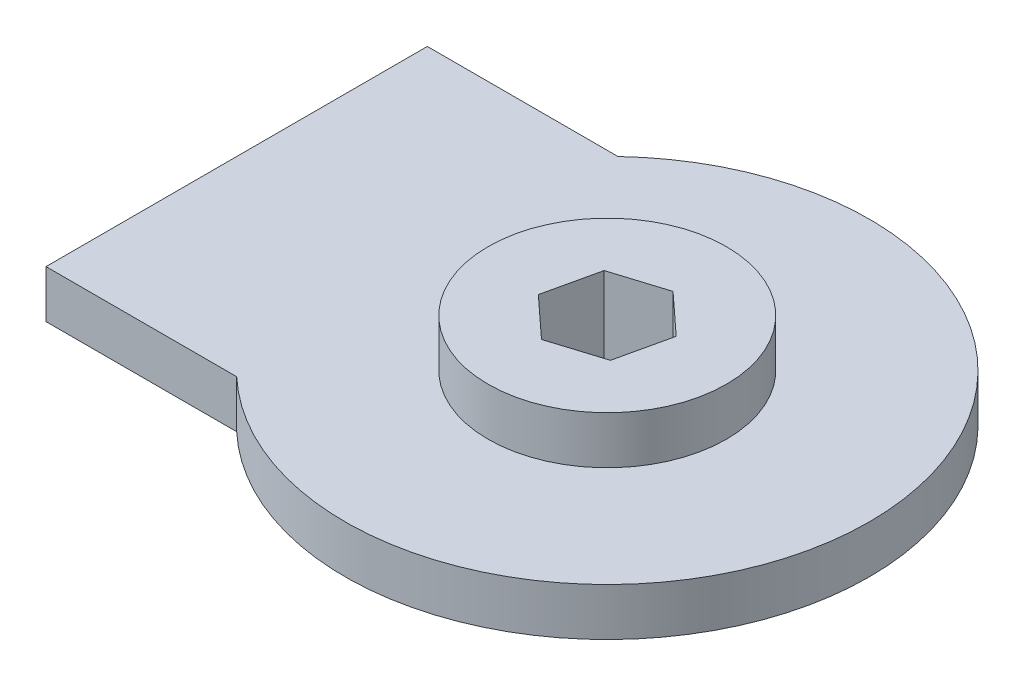
ISO-10303-21;
HEADER;
FILE_DESCRIPTION(('STEP AP214'),'2;1');
FILE_NAME('part.step','',(''),(''),'','','');
FILE_SCHEMA(('AUTOMOTIVE_DESIGN { 1 0 10303 214 1 1 1 1 }'));
ENDSEC;
DATA;
#1=APPLICATION_CONTEXT('core data for automotive mechanical design processes');
#2=APPLICATION_PROTOCOL_DEFINITION('international standard','automotive_design',2000,#1);
#3=PRODUCT_CONTEXT('',#1,'mechanical');
#4=PRODUCT('Part','Part','',(#3));
#5=PRODUCT_RELATED_PRODUCT_CATEGORY('part','',(#4));
#6=PRODUCT_DEFINITION_FORMATION('','',#4);
#7=PRODUCT_DEFINITION_CONTEXT('part definition',#1,'design');
#8=PRODUCT_DEFINITION('design','',#6,#7);
#9=PRODUCT_DEFINITION_SHAPE('','',#8);
#10=(LENGTH_UNIT() NAMED_UNIT(*) SI_UNIT(.MILLI.,.METRE.));
#11=(NAMED_UNIT(*) PLANE_ANGLE_UNIT() SI_UNIT($,.RADIAN.));
#12=(NAMED_UNIT(*) SI_UNIT($,.STERADIAN.) SOLID_ANGLE_UNIT());
#13=UNCERTAINTY_MEASURE_WITH_UNIT(LENGTH_MEASURE(1.E-05),#10,'distance_accuracy_value','');
#14=(GEOMETRIC_REPRESENTATION_CONTEXT(3) GLOBAL_UNCERTAINTY_ASSIGNED_CONTEXT((#13)) GLOBAL_UNIT_ASSIGNED_CONTEXT((#10,
#11,#12)) REPRESENTATION_CONTEXT('',''));
#15=CARTESIAN_POINT('',(0.,0.,0.));
#16=DIRECTION('',(0.,0.,1.));
#17=DIRECTION('',(1.,0.,0.));
#18=AXIS2_PLACEMENT_3D('',#15,#16,#17);
#19=CARTESIAN_POINT('',(0.,6.35,25.4));
#20=DIRECTION('',(0.,0.,1.));
#21=DIRECTION('',(1.,0.,0.));
#22=AXIS2_PLACEMENT_3D('',#19,#20,#21);
#23=PLANE('',#22);
#24=DIRECTION('',(-1.,0.,0.));
#25=VECTOR('',#24,1.);
#26=CARTESIAN_POINT('',(0.,0.,25.4));
#27=LINE('',#26,#25);
#28=CARTESIAN_POINT('',(-23.9707243319846,0.,25.4));
#29=VERTEX_POINT('',#28);
#30=CARTESIAN_POINT('',(-49.3707243319846,0.,25.4));
#31=VERTEX_POINT('',#30);
#32=EDGE_CURVE('E166',#29,#31,#27,.T.);
#33=ORIENTED_EDGE('',*,*,#32,.F.);
#34=DIRECTION('',(0.,-1.,0.));
#35=VECTOR('',#34,1.);
#36=CARTESIAN_POINT('',(-23.9707243319846,6.35,25.4));
#37=LINE('',#36,#35);
#38=CARTESIAN_POINT('',(-23.9707243319846,6.35,25.4));
#39=VERTEX_POINT('',#38);
#40=EDGE_CURVE('E11',#39,#29,#37,.T.);
#41=ORIENTED_EDGE('',*,*,#40,.F.);
#42=DIRECTION('',(-1.,0.,0.));
#43=VECTOR('',#42,1.);
#44=CARTESIAN_POINT('',(0.,6.35,25.4));
#45=LINE('',#44,#43);
#46=CARTESIAN_POINT('',(-49.3707243319846,6.35,25.4));
#47=VERTEX_POINT('',#46);
#48=EDGE_CURVE('E169',#39,#47,#45,.T.);
#49=ORIENTED_EDGE('',*,*,#48,.T.);
#50=DIRECTION('',(0.,-1.,0.));
#51=VECTOR('',#50,1.);
#52=CARTESIAN_POINT('',(-49.3707243319846,6.35,25.4));
#53=LINE('',#52,#51);
#54=EDGE_CURVE('E179',#47,#31,#53,.T.);
#55=ORIENTED_EDGE('',*,*,#54,.T.);
#56=EDGE_LOOP('',(#33,#41,#49,#55));
#57=FACE_BOUND('',#56,.T.);
#58=ADVANCED_FACE('F35',(#57),#23,.T.);
#59=CARTESIAN_POINT('',(0.,6.35,0.));
#60=DIRECTION('',(0.,-1.,0.));
#61=DIRECTION('',(0.,0.,-1.));
#62=AXIS2_PLACEMENT_3D('',#59,#60,#61);
#63=CYLINDRICAL_SURFACE('',#62,34.925);
#64=CARTESIAN_POINT('',(0.,0.,0.));
#65=DIRECTION('',(0.,1.,0.));
#66=DIRECTION('',(0.,0.,1.));
#67=AXIS2_PLACEMENT_3D('',#64,#65,#66);
#68=CIRCLE('',#67,34.925);
#69=CARTESIAN_POINT('',(-23.9707243319846,0.,-25.4));
#70=VERTEX_POINT('',#69);
#71=EDGE_CURVE('E182',#29,#70,#68,.T.);
#72=ORIENTED_EDGE('',*,*,#71,.T.);
#73=DIRECTION('',(0.,-1.,0.));
#74=VECTOR('',#73,1.);
#75=CARTESIAN_POINT('',(-23.9707243319846,6.35,-25.4));
#76=LINE('',#75,#74);
#77=CARTESIAN_POINT('',(-23.9707243319846,6.35,-25.4));
#78=VERTEX_POINT('',#77);
#79=EDGE_CURVE('E42',#78,#70,#76,.T.);
#80=ORIENTED_EDGE('',*,*,#79,.F.);
#81=CARTESIAN_POINT('',(0.,6.35,0.));
#82=DIRECTION('',(0.,1.,0.));
#83=DIRECTION('',(0.,0.,1.));
#84=AXIS2_PLACEMENT_3D('',#81,#82,#83);
#85=CIRCLE('',#84,34.925);
#86=EDGE_CURVE('E172',#39,#78,#85,.T.);
#87=ORIENTED_EDGE('',*,*,#86,.F.);
#88=ORIENTED_EDGE('',*,*,#40,.T.);
#89=EDGE_LOOP('',(#72,#80,#87,#88));
#90=FACE_BOUND('',#89,.T.);
#91=ADVANCED_FACE('F210',(#90),#63,.T.);
#92=CARTESIAN_POINT('',(0.,6.35,-25.4));
#93=DIRECTION('',(0.,0.,1.));
#94=DIRECTION('',(1.,0.,0.));
#95=AXIS2_PLACEMENT_3D('',#92,#93,#94);
#96=PLANE('',#95);
#97=DIRECTION('',(-1.,0.,0.));
#98=VECTOR('',#97,1.);
#99=CARTESIAN_POINT('',(0.,0.,-25.4));
#100=LINE('',#99,#98);
#101=CARTESIAN_POINT('',(-49.3707243319846,0.,-25.4));
#102=VERTEX_POINT('',#101);
#103=EDGE_CURVE('E184',#70,#102,#100,.T.);
#104=ORIENTED_EDGE('',*,*,#103,.T.);
#105=DIRECTION('',(0.,-1.,0.));
#106=VECTOR('',#105,1.);
#107=CARTESIAN_POINT('',(-49.3707243319846,6.35,-25.4));
#108=LINE('',#107,#106);
#109=CARTESIAN_POINT('',(-49.3707243319846,6.35,-25.4));
#110=VERTEX_POINT('',#109);
#111=EDGE_CURVE('E189',#110,#102,#108,.T.);
#112=ORIENTED_EDGE('',*,*,#111,.F.);
#113=DIRECTION('',(-1.,0.,0.));
#114=VECTOR('',#113,1.);
#115=CARTESIAN_POINT('',(0.,6.35,-25.4));
#116=LINE('',#115,#114);
#117=EDGE_CURVE('E175',#78,#110,#116,.T.);
#118=ORIENTED_EDGE('',*,*,#117,.F.);
#119=ORIENTED_EDGE('',*,*,#79,.T.);
#120=EDGE_LOOP('',(#104,#112,#118,#119));
#121=FACE_BOUND('',#120,.T.);
#122=ADVANCED_FACE('F196',(#121),#96,.F.);
#123=CARTESIAN_POINT('',(-49.3707243319846,6.35,0.));
#124=DIRECTION('',(1.,0.,0.));
#125=DIRECTION('',(0.,0.,-1.));
#126=AXIS2_PLACEMENT_3D('',#123,#124,#125);
#127=PLANE('',#126);
#128=DIRECTION('',(0.,0.,1.));
#129=VECTOR('',#128,1.);
#130=CARTESIAN_POINT('',(-49.3707243319846,0.,0.));
#131=LINE('',#130,#129);
#132=EDGE_CURVE('E173',#102,#31,#131,.T.);
#133=ORIENTED_EDGE('',*,*,#132,.T.);
#134=ORIENTED_EDGE('',*,*,#54,.F.);
#135=DIRECTION('',(0.,0.,1.));
#136=VECTOR('',#135,1.);
#137=CARTESIAN_POINT('',(-49.3707243319846,6.35,0.));
#138=LINE('',#137,#136);
#139=EDGE_CURVE('E177',#110,#47,#138,.T.);
#140=ORIENTED_EDGE('',*,*,#139,.F.);
#141=ORIENTED_EDGE('',*,*,#111,.T.);
#142=EDGE_LOOP('',(#133,#134,#140,#141));
#143=FACE_BOUND('',#142,.T.);
#144=ADVANCED_FACE('F205',(#143),#127,.F.);
#145=CARTESIAN_POINT('',(0.,6.35,0.));
#146=DIRECTION('',(0.,1.,0.));
#147=DIRECTION('',(0.,0.,1.));
#148=AXIS2_PLACEMENT_3D('',#145,#146,#147);
#149=PLANE('',#148);
#150=CARTESIAN_POINT('',(0.,6.35,0.));
#151=DIRECTION('',(0.,1.,0.));
#152=DIRECTION('',(0.,0.,1.));
#153=AXIS2_PLACEMENT_3D('',#150,#151,#152);
#154=CIRCLE('',#153,15.875);
#155=CARTESIAN_POINT('',(0.,6.35,15.875));
#156=VERTEX_POINT('',#155);
#157=EDGE_CURVE('E155',#156,#156,#154,.T.);
#158=ORIENTED_EDGE('',*,*,#157,.F.);
#159=EDGE_LOOP('',(#158));
#160=FACE_BOUND('',#159,.T.);
#161=ORIENTED_EDGE('',*,*,#48,.F.);
#162=ORIENTED_EDGE('',*,*,#86,.T.);
#163=ORIENTED_EDGE('',*,*,#117,.T.);
#164=ORIENTED_EDGE('',*,*,#139,.T.);
#165=EDGE_LOOP('',(#161,#162,#163,#164));
#166=FACE_BOUND('',#165,.T.);
#167=ADVANCED_FACE('F209',(#160,#166),#149,.T.);
#168=CARTESIAN_POINT('',(0.,0.,0.));
#169=DIRECTION('',(0.,1.,0.));
#170=DIRECTION('',(0.,0.,1.));
#171=AXIS2_PLACEMENT_3D('',#168,#169,#170);
#172=PLANE('',#171);
#173=DIRECTION('',(0.73526417581075,0.,0.677780636909419));
#174=VECTOR('',#173,1.);
#175=CARTESIAN_POINT('',(-6.9995136027942,0.,2.18406562576134));
#176=LINE('',#175,#174);
#177=CARTESIAN_POINT('',(-6.9995136027942,0.,2.18406562576134));
#178=VERTEX_POINT('',#177);
#179=CARTESIAN_POINT('',(-1.60830048595542,0.,7.15378940703519));
#180=VERTEX_POINT('',#179);
#181=EDGE_CURVE('E118',#178,#180,#176,.T.);
#182=ORIENTED_EDGE('',*,*,#181,.T.);
#183=DIRECTION('',(0.954607337662129,0.,-0.297867136290028));
#184=VECTOR('',#183,1.);
#185=CARTESIAN_POINT('',(-1.60830048595542,0.,7.15378940703519));
#186=LINE('',#185,#184);
#187=CARTESIAN_POINT('',(5.39121311683878,0.,4.96972378127385));
#188=VERTEX_POINT('',#187);
#189=EDGE_CURVE('E112',#180,#188,#186,.T.);
#190=ORIENTED_EDGE('',*,*,#189,.T.);
#191=DIRECTION('',(0.219343161851379,0.,-0.975647773199447));
#192=VECTOR('',#191,1.);
#193=CARTESIAN_POINT('',(5.39121311683878,0.,4.96972378127385));
#194=LINE('',#193,#192);
#195=CARTESIAN_POINT('',(6.9995136027942,0.,-2.18406562576134));
#196=VERTEX_POINT('',#195);
#197=EDGE_CURVE('E121',#188,#196,#194,.T.);
#198=ORIENTED_EDGE('',*,*,#197,.T.);
#199=DIRECTION('',(-0.73526417581075,0.,-0.677780636909419));
#200=VECTOR('',#199,1.);
#201=CARTESIAN_POINT('',(6.9995136027942,0.,-2.18406562576134));
#202=LINE('',#201,#200);
#203=CARTESIAN_POINT('',(1.60830048595543,0.,-7.15378940703519));
#204=VERTEX_POINT('',#203);
#205=EDGE_CURVE('E49',#196,#204,#202,.T.);
#206=ORIENTED_EDGE('',*,*,#205,.T.);
#207=DIRECTION('',(-0.954607337662129,0.,0.297867136290028));
#208=VECTOR('',#207,1.);
#209=CARTESIAN_POINT('',(1.60830048595543,0.,-7.15378940703519));
#210=LINE('',#209,#208);
#211=CARTESIAN_POINT('',(-5.39121311683878,0.,-4.96972378127385));
#212=VERTEX_POINT('',#211);
#213=EDGE_CURVE('E136',#204,#212,#210,.T.);
#214=ORIENTED_EDGE('',*,*,#213,.T.);
#215=DIRECTION('',(-0.219343161851379,0.,0.975647773199447));
#216=VECTOR('',#215,1.);
#217=CARTESIAN_POINT('',(-5.39121311683878,0.,-4.96972378127385));
#218=LINE('',#217,#216);
#219=EDGE_CURVE('E139',#212,#178,#218,.T.);
#220=ORIENTED_EDGE('',*,*,#219,.T.);
#221=EDGE_LOOP('',(#182,#190,#198,#206,#214,#220));
#222=FACE_BOUND('',#221,.T.);
#223=ORIENTED_EDGE('',*,*,#32,.T.);
#224=ORIENTED_EDGE('',*,*,#132,.F.);
#225=ORIENTED_EDGE('',*,*,#103,.F.);
#226=ORIENTED_EDGE('',*,*,#71,.F.);
#227=EDGE_LOOP('',(#223,#224,#225,#226));
#228=FACE_BOUND('',#227,.T.);
#229=ADVANCED_FACE('F125',(#222,#228),#172,.F.);
#230=CARTESIAN_POINT('',(0.,12.7,0.));
#231=DIRECTION('',(0.,-1.,0.));
#232=DIRECTION('',(0.,0.,-1.));
#233=AXIS2_PLACEMENT_3D('',#230,#231,#232);
#234=CYLINDRICAL_SURFACE('',#233,15.875);
#235=CARTESIAN_POINT('',(0.,12.7,0.));
#236=DIRECTION('',(0.,1.,0.));
#237=DIRECTION('',(0.,0.,1.));
#238=AXIS2_PLACEMENT_3D('',#235,#236,#237);
#239=CIRCLE('',#238,15.875);
#240=CARTESIAN_POINT('',(0.,12.7,15.875));
#241=VERTEX_POINT('',#240);
#242=EDGE_CURVE('E163',#241,#241,#239,.T.);
#243=ORIENTED_EDGE('',*,*,#242,.F.);
#244=EDGE_LOOP('',(#243));
#245=FACE_BOUND('',#244,.T.);
#246=ORIENTED_EDGE('',*,*,#157,.T.);
#247=EDGE_LOOP('',(#246));
#248=FACE_BOUND('',#247,.T.);
#249=ADVANCED_FACE('F225',(#245,#248),#234,.T.);
#250=CARTESIAN_POINT('',(0.,12.7,0.));
#251=DIRECTION('',(0.,1.,0.));
#252=DIRECTION('',(0.,0.,1.));
#253=AXIS2_PLACEMENT_3D('',#250,#251,#252);
#254=PLANE('',#253);
#255=DIRECTION('',(0.954607337662129,0.,-0.297867136290028));
#256=VECTOR('',#255,1.);
#257=CARTESIAN_POINT('',(-1.60830048595542,12.7,7.15378940703519));
#258=LINE('',#257,#256);
#259=CARTESIAN_POINT('',(-1.60830048595542,12.7,7.15378940703519));
#260=VERTEX_POINT('',#259);
#261=CARTESIAN_POINT('',(5.39121311683878,12.7,4.96972378127385));
#262=VERTEX_POINT('',#261);
#263=EDGE_CURVE('E57',#260,#262,#258,.T.);
#264=ORIENTED_EDGE('',*,*,#263,.F.);
#265=DIRECTION('',(0.73526417581075,0.,0.677780636909419));
#266=VECTOR('',#265,1.);
#267=CARTESIAN_POINT('',(-6.9995136027942,12.7,2.18406562576134));
#268=LINE('',#267,#266);
#269=CARTESIAN_POINT('',(-6.9995136027942,12.7,2.18406562576134));
#270=VERTEX_POINT('',#269);
#271=EDGE_CURVE('E129',#270,#260,#268,.T.);
#272=ORIENTED_EDGE('',*,*,#271,.F.);
#273=DIRECTION('',(-0.219343161851379,0.,0.975647773199447));
#274=VECTOR('',#273,1.);
#275=CARTESIAN_POINT('',(-5.39121311683878,12.7,-4.96972378127385));
#276=LINE('',#275,#274);
#277=CARTESIAN_POINT('',(-5.39121311683878,12.7,-4.96972378127385));
#278=VERTEX_POINT('',#277);
#279=EDGE_CURVE('E132',#278,#270,#276,.T.);
#280=ORIENTED_EDGE('',*,*,#279,.F.);
#281=DIRECTION('',(-0.954607337662129,0.,0.297867136290028));
#282=VECTOR('',#281,1.);
#283=CARTESIAN_POINT('',(1.60830048595543,12.7,-7.15378940703519));
#284=LINE('',#283,#282);
#285=CARTESIAN_POINT('',(1.60830048595543,12.7,-7.15378940703519));
#286=VERTEX_POINT('',#285);
#287=EDGE_CURVE('E148',#286,#278,#284,.T.);
#288=ORIENTED_EDGE('',*,*,#287,.F.);
#289=DIRECTION('',(-0.73526417581075,0.,-0.677780636909419));
#290=VECTOR('',#289,1.);
#291=CARTESIAN_POINT('',(6.9995136027942,12.7,-2.18406562576134));
#292=LINE('',#291,#290);
#293=CARTESIAN_POINT('',(6.9995136027942,12.7,-2.18406562576134));
#294=VERTEX_POINT('',#293);
#295=EDGE_CURVE('E145',#294,#286,#292,.T.);
#296=ORIENTED_EDGE('',*,*,#295,.F.);
#297=DIRECTION('',(0.219343161851379,0.,-0.975647773199447));
#298=VECTOR('',#297,1.);
#299=CARTESIAN_POINT('',(5.39121311683878,12.7,4.96972378127385));
#300=LINE('',#299,#298);
#301=EDGE_CURVE('E143',#262,#294,#300,.T.);
#302=ORIENTED_EDGE('',*,*,#301,.F.);
#303=EDGE_LOOP('',(#264,#272,#280,#288,#296,#302));
#304=FACE_BOUND('',#303,.T.);
#305=ORIENTED_EDGE('',*,*,#242,.T.);
#306=EDGE_LOOP('',(#305));
#307=FACE_BOUND('',#306,.T.);
#308=ADVANCED_FACE('F231',(#304,#307),#254,.T.);
#309=CARTESIAN_POINT('',(-1.60830048595542,0.,7.15378940703519));
#310=DIRECTION('',(0.297867136290028,0.,0.954607337662129));
#311=DIRECTION('',(0.954607337662129,0.,-0.297867136290028));
#312=AXIS2_PLACEMENT_3D('',#309,#310,#311);
#313=PLANE('',#312);
#314=ORIENTED_EDGE('',*,*,#263,.T.);
#315=DIRECTION('',(0.,1.,0.));
#316=VECTOR('',#315,1.);
#317=CARTESIAN_POINT('',(5.39121311683878,0.,4.96972378127385));
#318=LINE('',#317,#316);
#319=EDGE_CURVE('E108',#188,#262,#318,.T.);
#320=ORIENTED_EDGE('',*,*,#319,.F.);
#321=ORIENTED_EDGE('',*,*,#189,.F.);
#322=DIRECTION('',(0.,1.,0.));
#323=VECTOR('',#322,1.);
#324=CARTESIAN_POINT('',(-1.60830048595542,0.,7.15378940703519));
#325=LINE('',#324,#323);
#326=EDGE_CURVE('E153',#180,#260,#325,.T.);
#327=ORIENTED_EDGE('',*,*,#326,.T.);
#328=EDGE_LOOP('',(#314,#320,#321,#327));
#329=FACE_BOUND('',#328,.T.);
#330=ADVANCED_FACE('F110',(#329),#313,.F.);
#331=CARTESIAN_POINT('',(-6.9995136027942,0.,2.18406562576134));
#332=DIRECTION('',(-0.677780636909419,0.,0.73526417581075));
#333=DIRECTION('',(0.73526417581075,0.,0.677780636909419));
#334=AXIS2_PLACEMENT_3D('',#331,#332,#333);
#335=PLANE('',#334);
#336=ORIENTED_EDGE('',*,*,#271,.T.);
#337=ORIENTED_EDGE('',*,*,#326,.F.);
#338=ORIENTED_EDGE('',*,*,#181,.F.);
#339=DIRECTION('',(0.,1.,0.));
#340=VECTOR('',#339,1.);
#341=CARTESIAN_POINT('',(-6.9995136027942,0.,2.18406562576134));
#342=LINE('',#341,#340);
#343=EDGE_CURVE('E156',#178,#270,#342,.T.);
#344=ORIENTED_EDGE('',*,*,#343,.T.);
#345=EDGE_LOOP('',(#336,#337,#338,#344));
#346=FACE_BOUND('',#345,.T.);
#347=ADVANCED_FACE('F238',(#346),#335,.F.);
#348=CARTESIAN_POINT('',(-5.39121311683878,0.,-4.96972378127385));
#349=DIRECTION('',(-0.975647773199447,0.,-0.219343161851379));
#350=DIRECTION('',(-0.219343161851379,0.,0.975647773199447));
#351=AXIS2_PLACEMENT_3D('',#348,#349,#350);
#352=PLANE('',#351);
#353=ORIENTED_EDGE('',*,*,#279,.T.);
#354=ORIENTED_EDGE('',*,*,#343,.F.);
#355=ORIENTED_EDGE('',*,*,#219,.F.);
#356=DIRECTION('',(0.,1.,0.));
#357=VECTOR('',#356,1.);
#358=CARTESIAN_POINT('',(-5.39121311683878,0.,-4.96972378127385));
#359=LINE('',#358,#357);
#360=EDGE_CURVE('E158',#212,#278,#359,.T.);
#361=ORIENTED_EDGE('',*,*,#360,.T.);
#362=EDGE_LOOP('',(#353,#354,#355,#361));
#363=FACE_BOUND('',#362,.T.);
#364=ADVANCED_FACE('F247',(#363),#352,.F.);
#365=CARTESIAN_POINT('',(1.60830048595543,0.,-7.15378940703519));
#366=DIRECTION('',(-0.297867136290028,0.,-0.954607337662129));
#367=DIRECTION('',(-0.954607337662129,0.,0.297867136290028));
#368=AXIS2_PLACEMENT_3D('',#365,#366,#367);
#369=PLANE('',#368);
#370=ORIENTED_EDGE('',*,*,#287,.T.);
#371=ORIENTED_EDGE('',*,*,#360,.F.);
#372=ORIENTED_EDGE('',*,*,#213,.F.);
#373=DIRECTION('',(0.,1.,0.));
#374=VECTOR('',#373,1.);
#375=CARTESIAN_POINT('',(1.60830048595543,0.,-7.15378940703519));
#376=LINE('',#375,#374);
#377=EDGE_CURVE('E160',#204,#286,#376,.T.);
#378=ORIENTED_EDGE('',*,*,#377,.T.);
#379=EDGE_LOOP('',(#370,#371,#372,#378));
#380=FACE_BOUND('',#379,.T.);
#381=ADVANCED_FACE('F244',(#380),#369,.F.);
#382=CARTESIAN_POINT('',(6.9995136027942,0.,-2.18406562576134));
#383=DIRECTION('',(0.677780636909419,0.,-0.73526417581075));
#384=DIRECTION('',(-0.73526417581075,0.,-0.677780636909419));
#385=AXIS2_PLACEMENT_3D('',#382,#383,#384);
#386=PLANE('',#385);
#387=ORIENTED_EDGE('',*,*,#295,.T.);
#388=ORIENTED_EDGE('',*,*,#377,.F.);
#389=ORIENTED_EDGE('',*,*,#205,.F.);
#390=DIRECTION('',(0.,1.,0.));
#391=VECTOR('',#390,1.);
#392=CARTESIAN_POINT('',(6.9995136027942,0.,-2.18406562576134));
#393=LINE('',#392,#391);
#394=EDGE_CURVE('E117',#196,#294,#393,.T.);
#395=ORIENTED_EDGE('',*,*,#394,.T.);
#396=EDGE_LOOP('',(#387,#388,#389,#395));
#397=FACE_BOUND('',#396,.T.);
#398=ADVANCED_FACE('F241',(#397),#386,.F.);
#399=CARTESIAN_POINT('',(5.39121311683878,0.,4.96972378127385));
#400=DIRECTION('',(0.975647773199447,0.,0.219343161851379));
#401=DIRECTION('',(0.219343161851379,0.,-0.975647773199447));
#402=AXIS2_PLACEMENT_3D('',#399,#400,#401);
#403=PLANE('',#402);
#404=ORIENTED_EDGE('',*,*,#301,.T.);
#405=ORIENTED_EDGE('',*,*,#394,.F.);
#406=ORIENTED_EDGE('',*,*,#197,.F.);
#407=ORIENTED_EDGE('',*,*,#319,.T.);
#408=EDGE_LOOP('',(#404,#405,#406,#407));
#409=FACE_BOUND('',#408,.T.);
#410=ADVANCED_FACE('F122',(#409),#403,.F.);
#411=CLOSED_SHELL('',(#58,#91,#122,#144,#167,#229,#249,#308,#330,#347,#364,#381,#398,#410));
#412=MANIFOLD_SOLID_BREP('B2',#411);
#413=ADVANCED_BREP_SHAPE_REPRESENTATION('',(#18,#412),#14);
#414=SHAPE_DEFINITION_REPRESENTATION(#9,#413);
ENDSEC;
END-ISO-10303-21;
